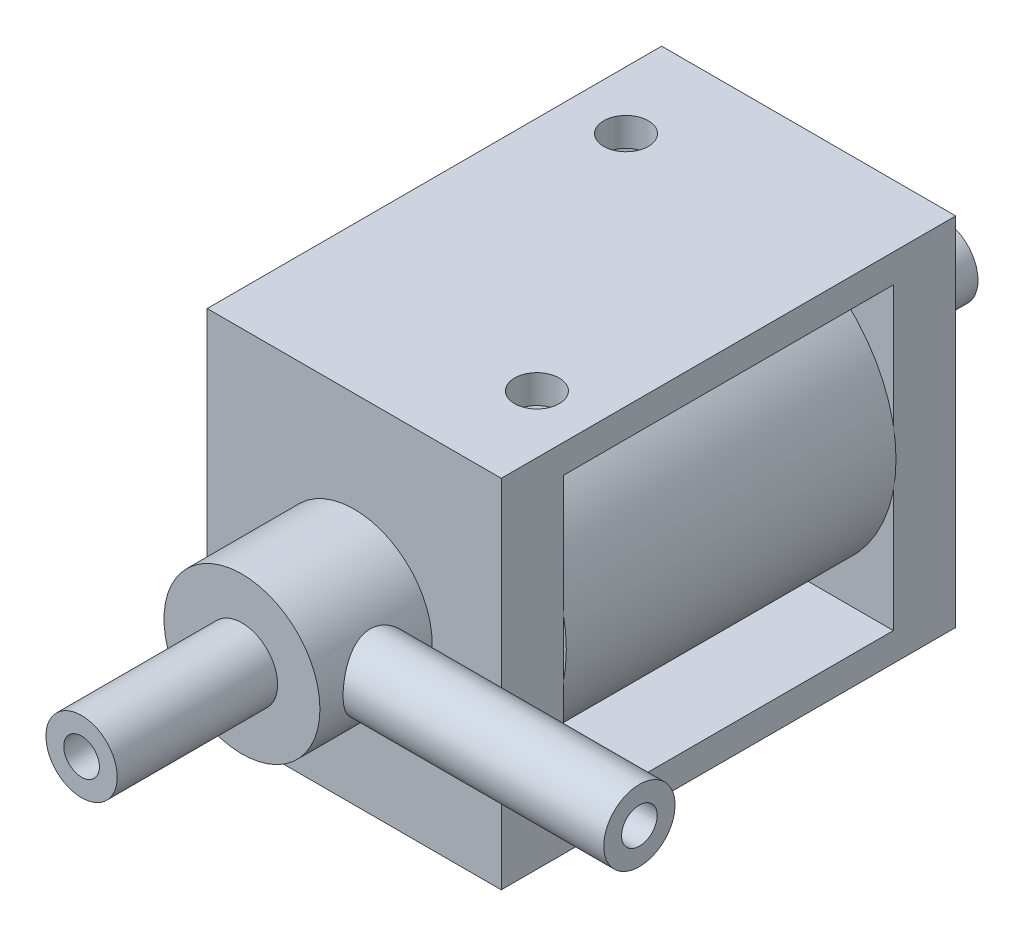
ISO-10303-21;
HEADER;
FILE_DESCRIPTION(('STEP AP214'),'2;1');
FILE_NAME('part.step','',(''),(''),'','','');
FILE_SCHEMA(('AUTOMOTIVE_DESIGN { 1 0 10303 214 1 1 1 1 }'));
ENDSEC;
DATA;
#1=APPLICATION_CONTEXT('core data for automotive mechanical design processes');
#2=APPLICATION_PROTOCOL_DEFINITION('international standard','automotive_design',2000,#1);
#3=PRODUCT_CONTEXT('',#1,'mechanical');
#4=PRODUCT('Part','Part','',(#3));
#5=PRODUCT_RELATED_PRODUCT_CATEGORY('part','',(#4));
#6=PRODUCT_DEFINITION_FORMATION('','',#4);
#7=PRODUCT_DEFINITION_CONTEXT('part definition',#1,'design');
#8=PRODUCT_DEFINITION('design','',#6,#7);
#9=PRODUCT_DEFINITION_SHAPE('','',#8);
#10=(LENGTH_UNIT() NAMED_UNIT(*) SI_UNIT(.MILLI.,.METRE.));
#11=(NAMED_UNIT(*) PLANE_ANGLE_UNIT() SI_UNIT($,.RADIAN.));
#12=(NAMED_UNIT(*) SI_UNIT($,.STERADIAN.) SOLID_ANGLE_UNIT());
#13=UNCERTAINTY_MEASURE_WITH_UNIT(LENGTH_MEASURE(1.E-05),#10,'distance_accuracy_value','');
#14=(GEOMETRIC_REPRESENTATION_CONTEXT(3) GLOBAL_UNCERTAINTY_ASSIGNED_CONTEXT((#13)) GLOBAL_UNIT_ASSIGNED_CONTEXT((#10,
#11,#12)) REPRESENTATION_CONTEXT('',''));
#15=CARTESIAN_POINT('',(0.,0.,0.));
#16=DIRECTION('',(0.,0.,1.));
#17=DIRECTION('',(1.,0.,0.));
#18=AXIS2_PLACEMENT_3D('',#15,#16,#17);
#19=CARTESIAN_POINT('',(0.,0.,19.05));
#20=DIRECTION('',(0.,0.,-1.));
#21=DIRECTION('',(-1.,0.,0.));
#22=AXIS2_PLACEMENT_3D('',#19,#20,#21);
#23=CYLINDRICAL_SURFACE('',#22,4.375);
#24=CARTESIAN_POINT('',(4.375,0.,17.75));
#25=CARTESIAN_POINT('',(4.37499546071433,0.106193365117277,17.7499945368366));
#26=CARTESIAN_POINT('',(4.37109073332979,0.212544209042542,17.7414923973472));
#27=CARTESIAN_POINT('',(4.35585834899322,0.422168273851068,17.7078290942485));
#28=CARTESIAN_POINT('',(4.34451363476174,0.525433851101796,17.6826296481948));
#29=CARTESIAN_POINT('',(4.31560196554178,0.725524948602718,17.6167258561263));
#30=CARTESIAN_POINT('',(4.29805771206282,0.822372454205626,17.5760780385728));
#31=CARTESIAN_POINT('',(4.25840859389427,1.0077598771999,17.4806923568213));
#32=CARTESIAN_POINT('',(4.23630461170441,1.09630139733282,17.4259572186068));
#33=CARTESIAN_POINT('',(4.18826015930736,1.26785379077356,17.300619973238));
#34=CARTESIAN_POINT('',(4.16217839118232,1.35032228554845,17.2293303027463));
#35=CARTESIAN_POINT('',(4.10965587357946,1.5026161842428,17.0743711969988));
#36=CARTESIAN_POINT('',(4.08321490881867,1.57243361073921,16.990694010509));
#37=CARTESIAN_POINT('',(4.03110878098186,1.70174861674835,16.8070821904239));
#38=CARTESIAN_POINT('',(4.00559311754638,1.7603391070202,16.7064615975258));
#39=CARTESIAN_POINT('',(3.96052822141565,1.85952425844656,16.4954753108809));
#40=CARTESIAN_POINT('',(3.9409753207401,1.90012998986918,16.3851156621899));
#41=CARTESIAN_POINT('',(3.9116105066732,1.9598438084694,16.164000222026));
#42=CARTESIAN_POINT('',(3.90132579062807,1.98000289877455,16.053593809305));
#43=CARTESIAN_POINT('',(3.89033941737707,2.00151104221693,15.8305243594248));
#44=CARTESIAN_POINT('',(3.88963077008148,2.0028738158158,15.7178630284212));
#45=CARTESIAN_POINT('',(3.89748507604566,1.98753119797193,15.5050460976564));
#46=CARTESIAN_POINT('',(3.90516587680214,1.97254508123753,15.4047268484583));
#47=CARTESIAN_POINT('',(3.92741699456664,1.92785817840036,15.2082250050207));
#48=CARTESIAN_POINT('',(3.9419889818666,1.89815382479482,15.1120434198414));
#49=CARTESIAN_POINT('',(3.97671876938109,1.82428729059385,14.9239081976233));
#50=CARTESIAN_POINT('',(3.99699653255466,1.77981042971784,14.8321012747295));
#51=CARTESIAN_POINT('',(4.04083939769011,1.67789018695845,14.6568526159929));
#52=CARTESIAN_POINT('',(4.06440591424348,1.62044121877552,14.573414506513));
#53=CARTESIAN_POINT('',(4.11513505494747,1.48723588313,14.4081630059979));
#54=CARTESIAN_POINT('',(4.14241717027686,1.41019883583585,14.3274153389441));
#55=CARTESIAN_POINT('',(4.19548052183614,1.24347071342626,14.1795865111469));
#56=CARTESIAN_POINT('',(4.22126124916282,1.15377538258158,14.1125099652638));
#57=CARTESIAN_POINT('',(4.26946716124552,0.96047163604375,13.991908718962));
#58=CARTESIAN_POINT('',(4.29175400576567,0.856502507415118,13.9389026121808));
#59=CARTESIAN_POINT('',(4.32935104676508,0.63984227925141,13.8515216291546));
#60=CARTESIAN_POINT('',(4.34466589644316,0.527157055885009,13.8171343235719));
#61=CARTESIAN_POINT('',(4.36566890573708,0.305091670846782,13.770393904051));
#62=CARTESIAN_POINT('',(4.3719779901027,0.196070364375256,13.7566160293197));
#63=CARTESIAN_POINT('',(4.37630831194233,-0.0229034238321223,13.7471340762241));
#64=CARTESIAN_POINT('',(4.37433258761118,-0.132855549459489,13.7514233722918));
#65=CARTESIAN_POINT('',(4.36270302709761,-0.343328986731854,13.7770160961574));
#66=CARTESIAN_POINT('',(4.35353478861645,-0.444011306374139,13.7972438190641));
#67=CARTESIAN_POINT('',(4.32900818026246,-0.640399868337555,13.8525545751439));
#68=CARTESIAN_POINT('',(4.31364907370804,-0.736105516929612,13.8876393762582));
#69=CARTESIAN_POINT('',(4.27757960203174,-0.923201182245459,13.9727574348239));
#70=CARTESIAN_POINT('',(4.25671829316956,-1.01436587246377,14.023219840262));
#71=CARTESIAN_POINT('',(4.21177295563386,-1.18725988600378,14.137192755755));
#72=CARTESIAN_POINT('',(4.18768751391252,-1.26898504281731,14.200708993513));
#73=CARTESIAN_POINT('',(4.13630574739342,-1.42799147379549,14.3452440066322));
#74=CARTESIAN_POINT('',(4.10891028541243,-1.50430934352453,14.4272898351303));
#75=CARTESIAN_POINT('',(4.05567490122554,-1.64244275291062,14.6033071503929));
#76=CARTESIAN_POINT('',(4.02983563976401,-1.70425216427245,14.6972836508773));
#77=CARTESIAN_POINT('',(3.98205022058308,-1.81316001205381,14.8980323159779));
#78=CARTESIAN_POINT('',(3.9602356034775,-1.85979034304662,15.0050922682644));
#79=CARTESIAN_POINT('',(3.9245864507608,-1.93389930012533,15.2268702887841));
#80=CARTESIAN_POINT('',(3.91074352559509,-1.96139806698882,15.3415801636632));
#81=CARTESIAN_POINT('',(3.89406781288313,-1.99428429141605,15.5645480753998));
#82=CARTESIAN_POINT('',(3.89037375092534,-2.00140375153077,15.6724862302739));
#83=CARTESIAN_POINT('',(3.89205260827246,-1.99813871754398,15.8880120528146));
#84=CARTESIAN_POINT('',(3.89742326771774,-1.98775858613885,15.995599801139));
#85=CARTESIAN_POINT('',(3.91577558276452,-1.95133124360024,16.1998288981122));
#86=CARTESIAN_POINT('',(3.92822125438508,-1.92638429218147,16.296719880965));
#87=CARTESIAN_POINT('',(3.95879823180269,-1.86273481680529,16.4849104798026));
#88=CARTESIAN_POINT('',(3.97693120718982,-1.82402825306945,16.5762084444565));
#89=CARTESIAN_POINT('',(4.01830328755079,-1.73107154425101,16.7571784139131));
#90=CARTESIAN_POINT('',(4.04179888783152,-1.67596997350038,16.8463530285502));
#91=CARTESIAN_POINT('',(4.09067871316561,-1.55285459074365,17.0147255261307));
#92=CARTESIAN_POINT('',(4.11606377907563,-1.48483500877371,17.093918924463));
#93=CARTESIAN_POINT('',(4.16874511760391,-1.33021281309395,17.2478414735564));
#94=CARTESIAN_POINT('',(4.19599469793495,-1.24246033691109,17.3214374583764));
#95=CARTESIAN_POINT('',(4.24702004952989,-1.05492991579268,17.4530087574762));
#96=CARTESIAN_POINT('',(4.27079420144093,-0.955146404338692,17.5109768005723));
#97=CARTESIAN_POINT('',(4.31207357977044,-0.746876336094879,17.6088463199135));
#98=CARTESIAN_POINT('',(4.32962807027831,-0.638466900780915,17.6488904648511));
#99=CARTESIAN_POINT('',(4.35665048921604,-0.415603909691254,17.7097278251989));
#100=CARTESIAN_POINT('',(4.36614274431195,-0.301169650762393,17.7305789688629));
#101=CARTESIAN_POINT('',(4.37236651902097,-0.15493472081247,17.7442327408113));
#102=CARTESIAN_POINT('',(4.37335222620455,-0.123999599279322,17.746393264481));
#103=CARTESIAN_POINT('',(4.37466963526151,-0.0620474681630114,17.7492777040405));
#104=CARTESIAN_POINT('',(4.37500132641159,-0.0310304572455328,17.7500015963752));
#105=CARTESIAN_POINT('',(4.375,0.,17.75));
#106=B_SPLINE_CURVE_WITH_KNOTS('',3,(#24,#25,#26,#27,#28,#29,#30,#31,#32,#33,#34,#35,#36,#37,
#38,#39,#40,#41,#42,#43,#44,#45,#46,#47,#48,#49,#50,#51,#52,#53,#54,#55,#56,#57,#58,#59,#60,#61,
#62,#63,#64,#65,#66,#67,#68,#69,#70,#71,#72,#73,#74,#75,#76,#77,#78,#79,#80,#81,#82,#83,#84,#85,
#86,#87,#88,#89,#90,#91,#92,#93,#94,#95,#96,#97,#98,#99,#100,#101,#102,#103,#104,#105),
.UNSPECIFIED.,.T.,.F.,(4,2,2,2,2,2,2,2,2,2,2,2,2,2,2,2,2,2,2,2,2,2,2,2,2,2,2,2,2,2,2,2,2,2,2,2,
2,2,2,2,4),(0.,0.318452965679814,0.63763859669901,0.95566734130362,1.27363459159177,
1.60846563880891,1.94350709225491,2.29930134753291,2.65487629320834,2.99107259825779,
3.32702348220124,3.63077420605653,3.93459859104707,4.24536137999883,4.55625825172386,
4.89939468749385,5.24264676217309,5.59719438258375,5.95150502519658,6.27996109559762,
6.60829672552927,6.91619432504297,7.22412857361473,7.54159582342689,7.85920266865742,
8.20372303687421,8.54838866783039,8.90285151687821,9.25694063775477,9.57988718121181,
9.90275322511105,10.2039121320568,10.5051595314257,10.8261208609337,11.1472258897629,
11.4987426691373,11.8504227169221,12.1992514297757,12.5470238233084,12.6400765211623,
12.7331307447037),.UNSPECIFIED.);
#107=CARTESIAN_POINT('',(4.375,0.,17.75));
#108=VERTEX_POINT('',#107);
#109=EDGE_CURVE('E47',#108,#108,#106,.T.);
#110=ORIENTED_EDGE('',*,*,#109,.T.);
#111=EDGE_LOOP('',(#110));
#112=FACE_BOUND('',#111,.T.);
#113=CARTESIAN_POINT('',(0.,0.,19.05));
#114=DIRECTION('',(0.,0.,1.));
#115=DIRECTION('',(1.,0.,0.));
#116=AXIS2_PLACEMENT_3D('',#113,#114,#115);
#117=CIRCLE('',#116,4.375);
#118=CARTESIAN_POINT('',(4.375,0.,19.05));
#119=VERTEX_POINT('',#118);
#120=EDGE_CURVE('E59',#119,#119,#117,.T.);
#121=ORIENTED_EDGE('',*,*,#120,.F.);
#122=EDGE_LOOP('',(#121));
#123=FACE_BOUND('',#122,.T.);
#124=CARTESIAN_POINT('',(0.,0.,12.75));
#125=DIRECTION('',(0.,0.,1.));
#126=DIRECTION('',(1.,0.,0.));
#127=AXIS2_PLACEMENT_3D('',#124,#125,#126);
#128=CIRCLE('',#127,4.375);
#129=CARTESIAN_POINT('',(4.375,0.,12.75));
#130=VERTEX_POINT('',#129);
#131=EDGE_CURVE('E181',#130,#130,#128,.T.);
#132=ORIENTED_EDGE('',*,*,#131,.T.);
#133=EDGE_LOOP('',(#132));
#134=FACE_BOUND('',#133,.T.);
#135=ADVANCED_FACE('F43',(#112,#123,#134),#23,.T.);
#136=CARTESIAN_POINT('',(0.,0.,19.05));
#137=DIRECTION('',(0.,0.,1.));
#138=DIRECTION('',(1.,0.,0.));
#139=AXIS2_PLACEMENT_3D('',#136,#137,#138);
#140=PLANE('',#139);
#141=CARTESIAN_POINT('',(0.,0.,19.05));
#142=DIRECTION('',(0.,0.,1.));
#143=DIRECTION('',(1.,0.,0.));
#144=AXIS2_PLACEMENT_3D('',#141,#142,#143);
#145=CIRCLE('',#144,2.);
#146=CARTESIAN_POINT('',(2.,0.,19.05));
#147=VERTEX_POINT('',#146);
#148=EDGE_CURVE('E185',#147,#147,#145,.T.);
#149=ORIENTED_EDGE('',*,*,#148,.F.);
#150=EDGE_LOOP('',(#149));
#151=FACE_BOUND('',#150,.T.);
#152=ORIENTED_EDGE('',*,*,#120,.T.);
#153=EDGE_LOOP('',(#152));
#154=FACE_BOUND('',#153,.T.);
#155=ADVANCED_FACE('F94',(#151,#154),#140,.T.);
#156=CARTESIAN_POINT('',(0.,0.,12.75));
#157=DIRECTION('',(0.,0.,1.));
#158=DIRECTION('',(1.,0.,0.));
#159=AXIS2_PLACEMENT_3D('',#156,#157,#158);
#160=PLANE('',#159);
#161=ORIENTED_EDGE('',*,*,#131,.F.);
#162=EDGE_LOOP('',(#161));
#163=FACE_BOUND('',#162,.T.);
#164=ADVANCED_FACE('F89',(#163),#160,.F.);
#165=CARTESIAN_POINT('',(0.,0.,28.05));
#166=DIRECTION('',(0.,0.,1.));
#167=DIRECTION('',(1.,0.,0.));
#168=AXIS2_PLACEMENT_3D('',#165,#166,#167);
#169=PLANE('',#168);
#170=CARTESIAN_POINT('',(0.,0.,28.05));
#171=DIRECTION('',(0.,0.,1.));
#172=DIRECTION('',(1.,0.,0.));
#173=AXIS2_PLACEMENT_3D('',#170,#171,#172);
#174=CIRCLE('',#173,2.);
#175=CARTESIAN_POINT('',(2.,0.,28.05));
#176=VERTEX_POINT('',#175);
#177=EDGE_CURVE('E182',#176,#176,#174,.T.);
#178=ORIENTED_EDGE('',*,*,#177,.T.);
#179=EDGE_LOOP('',(#178));
#180=FACE_BOUND('',#179,.T.);
#181=CARTESIAN_POINT('',(0.,0.,28.05));
#182=DIRECTION('',(0.,0.,1.));
#183=DIRECTION('',(1.,0.,0.));
#184=AXIS2_PLACEMENT_3D('',#181,#182,#183);
#185=CIRCLE('',#184,1.);
#186=CARTESIAN_POINT('',(1.,0.,28.05));
#187=VERTEX_POINT('',#186);
#188=EDGE_CURVE('E189',#187,#187,#185,.T.);
#189=ORIENTED_EDGE('',*,*,#188,.F.);
#190=EDGE_LOOP('',(#189));
#191=FACE_BOUND('',#190,.T.);
#192=ADVANCED_FACE('F86',(#180,#191),#169,.T.);
#193=CARTESIAN_POINT('',(0.,0.,28.05));
#194=DIRECTION('',(0.,0.,-1.));
#195=DIRECTION('',(-1.,0.,0.));
#196=AXIS2_PLACEMENT_3D('',#193,#194,#195);
#197=CYLINDRICAL_SURFACE('',#196,2.);
#198=ORIENTED_EDGE('',*,*,#177,.F.);
#199=EDGE_LOOP('',(#198));
#200=FACE_BOUND('',#199,.T.);
#201=ORIENTED_EDGE('',*,*,#148,.T.);
#202=EDGE_LOOP('',(#201));
#203=FACE_BOUND('',#202,.T.);
#204=ADVANCED_FACE('F84',(#200,#203),#197,.T.);
#205=CARTESIAN_POINT('',(0.,0.,28.05));
#206=DIRECTION('',(0.,0.,-1.));
#207=DIRECTION('',(-1.,0.,0.));
#208=AXIS2_PLACEMENT_3D('',#205,#206,#207);
#209=CYLINDRICAL_SURFACE('',#208,1.);
#210=ORIENTED_EDGE('',*,*,#188,.T.);
#211=EDGE_LOOP('',(#210));
#212=FACE_BOUND('',#211,.T.);
#213=CARTESIAN_POINT('',(0.,0.,19.05));
#214=DIRECTION('',(0.,0.,1.));
#215=DIRECTION('',(1.,0.,0.));
#216=AXIS2_PLACEMENT_3D('',#213,#214,#215);
#217=CIRCLE('',#216,1.);
#218=CARTESIAN_POINT('',(1.,0.,19.05));
#219=VERTEX_POINT('',#218);
#220=EDGE_CURVE('E55',#219,#219,#217,.F.);
#221=ORIENTED_EDGE('',*,*,#220,.T.);
#222=EDGE_LOOP('',(#221));
#223=FACE_BOUND('',#222,.T.);
#224=ADVANCED_FACE('F81',(#212,#223),#209,.F.);
#225=ORIENTED_EDGE('',*,*,#220,.F.);
#226=EDGE_LOOP('',(#225));
#227=FACE_BOUND('',#226,.T.);
#228=ADVANCED_FACE('F79',(#227),#140,.T.);
#229=CARTESIAN_POINT('',(19.,0.,15.75));
#230=DIRECTION('',(-1.,0.,0.));
#231=DIRECTION('',(0.,0.,1.));
#232=AXIS2_PLACEMENT_3D('',#229,#230,#231);
#233=CYLINDRICAL_SURFACE('',#232,2.);
#234=CARTESIAN_POINT('',(19.,0.,15.75));
#235=DIRECTION('',(-1.,0.,0.));
#236=DIRECTION('',(0.,0.,1.));
#237=AXIS2_PLACEMENT_3D('',#234,#235,#236);
#238=CIRCLE('',#237,2.);
#239=CARTESIAN_POINT('',(19.,0.,17.75));
#240=VERTEX_POINT('',#239);
#241=EDGE_CURVE('E193',#240,#240,#238,.T.);
#242=ORIENTED_EDGE('',*,*,#241,.T.);
#243=EDGE_LOOP('',(#242));
#244=FACE_BOUND('',#243,.T.);
#245=ORIENTED_EDGE('',*,*,#109,.F.);
#246=EDGE_LOOP('',(#245));
#247=FACE_BOUND('',#246,.T.);
#248=ADVANCED_FACE('F71',(#244,#247),#233,.T.);
#249=CARTESIAN_POINT('',(19.,0.,15.75));
#250=DIRECTION('',(-1.,0.,0.));
#251=DIRECTION('',(0.,0.,1.));
#252=AXIS2_PLACEMENT_3D('',#249,#250,#251);
#253=CYLINDRICAL_SURFACE('',#252,1.);
#254=CARTESIAN_POINT('',(19.,0.,15.75));
#255=DIRECTION('',(-1.,0.,0.));
#256=DIRECTION('',(0.,0.,1.));
#257=AXIS2_PLACEMENT_3D('',#254,#255,#256);
#258=CIRCLE('',#257,1.);
#259=CARTESIAN_POINT('',(19.,0.,16.75));
#260=VERTEX_POINT('',#259);
#261=EDGE_CURVE('E196',#260,#260,#258,.T.);
#262=ORIENTED_EDGE('',*,*,#261,.F.);
#263=EDGE_LOOP('',(#262));
#264=FACE_BOUND('',#263,.T.);
#265=CARTESIAN_POINT('',(4.375,0.,16.75));
#266=CARTESIAN_POINT('',(4.374998992017,0.0553987338206958,16.7499982003981));
#267=CARTESIAN_POINT('',(4.37393713396282,0.110818689239782,16.745380941321));
#268=CARTESIAN_POINT('',(4.36980382628176,0.220080130322669,16.7270556168063));
#269=CARTESIAN_POINT('',(4.36673103037034,0.273920533258113,16.7133414610863));
#270=CARTESIAN_POINT('',(4.358917419308,0.378428401651893,16.6772777156263));
#271=CARTESIAN_POINT('',(4.35417842662918,0.429099262885577,16.6549375583234));
#272=CARTESIAN_POINT('',(4.34354183930829,0.525972554086817,16.6022869078205));
#273=CARTESIAN_POINT('',(4.33764425337255,0.572175017628595,16.5719764745131));
#274=CARTESIAN_POINT('',(4.32521988245972,0.659606421902991,16.5036869475399));
#275=CARTESIAN_POINT('',(4.31868470455059,0.700746349266981,16.4655954078376));
#276=CARTESIAN_POINT('',(4.30577980094118,0.776112477878595,16.3830661526582));
#277=CARTESIAN_POINT('',(4.29941009115495,0.810338016257433,16.3386278294238));
#278=CARTESIAN_POINT('',(4.2874740493319,0.871304330124403,16.243998359466));
#279=CARTESIAN_POINT('',(4.281918443642,0.897948896353852,16.193743754185));
#280=CARTESIAN_POINT('',(4.27236072116839,0.942379328349627,16.0893220320988));
#281=CARTESIAN_POINT('',(4.26835840014716,0.960166358858369,16.0351554307838));
#282=CARTESIAN_POINT('',(4.2624461369274,0.98607975653242,15.9254170245384));
#283=CARTESIAN_POINT('',(4.26050193904803,0.994364482720992,15.8698845002351));
#284=CARTESIAN_POINT('',(4.25882327819447,1.00153076908982,15.7581863552683));
#285=CARTESIAN_POINT('',(4.25908851757211,1.00041359586299,15.7020208208998));
#286=CARTESIAN_POINT('',(4.26176781492727,0.988934903526785,15.591839020284));
#287=CARTESIAN_POINT('',(4.26413878408462,0.978758745529995,15.5378022351749));
#288=CARTESIAN_POINT('',(4.27069410503424,0.949745223997651,15.4322237658541));
#289=CARTESIAN_POINT('',(4.27487856691354,0.930907334652477,15.3806822333265));
#290=CARTESIAN_POINT('',(4.28463096644945,0.884938622195016,15.2810435338298));
#291=CARTESIAN_POINT('',(4.29021051430542,0.857737740698141,15.2329798723914));
#292=CARTESIAN_POINT('',(4.30211746584171,0.795864352314275,15.142031186213));
#293=CARTESIAN_POINT('',(4.30844498022862,0.76119073876088,15.0991469299811));
#294=CARTESIAN_POINT('',(4.32131876263626,0.684381262664833,15.0187086280388));
#295=CARTESIAN_POINT('',(4.32786666251681,0.642088128356429,14.9813048597066));
#296=CARTESIAN_POINT('',(4.34030738362277,0.551753865544904,14.9140950986635));
#297=CARTESIAN_POINT('',(4.34620019076337,0.503712613500486,14.8842892692942));
#298=CARTESIAN_POINT('',(4.35668875071035,0.40305310702006,14.8330789839887));
#299=CARTESIAN_POINT('',(4.36128123689088,0.350423752320151,14.8116956350082));
#300=CARTESIAN_POINT('',(4.36862762683174,0.242190146305765,14.7781188327627));
#301=CARTESIAN_POINT('',(4.37138182315876,0.186586369897361,14.7659239171045));
#302=CARTESIAN_POINT('',(4.37469916678348,0.0752700598482324,14.7512920052733));
#303=CARTESIAN_POINT('',(4.37530835584735,0.0195858179888566,14.7486499272314));
#304=CARTESIAN_POINT('',(4.37439670362892,-0.0914285090066711,14.7526408323307));
#305=CARTESIAN_POINT('',(4.37287602087431,-0.146758620193076,14.7592731251744));
#306=CARTESIAN_POINT('',(4.36790468651016,-0.254804570675561,14.781454705042));
#307=CARTESIAN_POINT('',(4.36447761077611,-0.307543942174929,14.7968951225907));
#308=CARTESIAN_POINT('',(4.35607769764677,-0.409683437160066,14.8361327601916));
#309=CARTESIAN_POINT('',(4.35110472053148,-0.459083258322653,14.8599307356329));
#310=CARTESIAN_POINT('',(4.34005192503343,-0.553979804531902,14.915626183769));
#311=CARTESIAN_POINT('',(4.33395627892191,-0.5994049236002,14.9476424494722));
#312=CARTESIAN_POINT('',(4.32136421413796,-0.684311230387602,15.0187106432417));
#313=CARTESIAN_POINT('',(4.31486773836692,-0.723791568497651,15.0577635752173));
#314=CARTESIAN_POINT('',(4.30204510657645,-0.796508958848094,15.1427413158394));
#315=CARTESIAN_POINT('',(4.29572506376476,-0.829603390227962,15.1887892691614));
#316=CARTESIAN_POINT('',(4.2841201121098,-0.887591054211002,15.2859091946861));
#317=CARTESIAN_POINT('',(4.27883515740294,-0.912484650217416,15.3369809441391));
#318=CARTESIAN_POINT('',(4.26995200589377,-0.953188959219974,15.4424206238056));
#319=CARTESIAN_POINT('',(4.26634407645231,-0.969052203882402,15.4967674133527));
#320=CARTESIAN_POINT('',(4.26120800193017,-0.991395592304954,15.6074492635213));
#321=CARTESIAN_POINT('',(4.25967948860512,-0.99787739743979,15.6637839702886));
#322=CARTESIAN_POINT('',(4.25890001387684,-1.0011982122929,15.7754007557275));
#323=CARTESIAN_POINT('',(4.25959552287008,-0.998263852016477,15.8306758361562));
#324=CARTESIAN_POINT('',(4.26306384958155,-0.983345905321714,15.9399212252236));
#325=CARTESIAN_POINT('',(4.26583663799475,-0.971362446562699,15.9938915522579));
#326=CARTESIAN_POINT('',(4.27311984315789,-0.938800436669163,16.0987953849629));
#327=CARTESIAN_POINT('',(4.27762300323471,-0.918257750497151,16.1497405606461));
#328=CARTESIAN_POINT('',(4.28786179144995,-0.869190216461772,16.2474939491769));
#329=CARTESIAN_POINT('',(4.29359756134085,-0.840664450414953,16.2943016853366));
#330=CARTESIAN_POINT('',(4.30581301138899,-0.775701283561883,16.3835621665546));
#331=CARTESIAN_POINT('',(4.31230628199453,-0.739103626015833,16.4258964398818));
#332=CARTESIAN_POINT('',(4.32521702329615,-0.659356651962533,16.5038968497564));
#333=CARTESIAN_POINT('',(4.33163447601308,-0.616205813785251,16.5395614332769));
#334=CARTESIAN_POINT('',(4.34378078458555,-0.523825077282548,16.6037067196052));
#335=CARTESIAN_POINT('',(4.34949834552898,-0.47451632052015,16.6320761242433));
#336=CARTESIAN_POINT('',(4.3594858021036,-0.371707723854804,16.6800786356034));
#337=CARTESIAN_POINT('',(4.36375685899886,-0.318211288535488,16.6997187542362));
#338=CARTESIAN_POINT('',(4.36964675613247,-0.220585805784552,16.7263784722151));
#339=CARTESIAN_POINT('',(4.37164139044613,-0.176967502104129,16.7352189917084));
#340=CARTESIAN_POINT('',(4.37431838241016,-0.0889039924918735,16.7470303236871));
#341=CARTESIAN_POINT('',(4.37500080893085,-0.0444588300807796,16.7500014442242));
#342=CARTESIAN_POINT('',(4.375,0.,16.75));
#343=B_SPLINE_CURVE_WITH_KNOTS('',3,(#265,#266,#267,#268,#269,#270,#271,#272,#273,#274,#275,
#276,#277,#278,#279,#280,#281,#282,#283,#284,#285,#286,#287,#288,#289,#290,#291,#292,#293,#294,
#295,#296,#297,#298,#299,#300,#301,#302,#303,#304,#305,#306,#307,#308,#309,#310,#311,#312,#313,
#314,#315,#316,#317,#318,#319,#320,#321,#322,#323,#324,#325,#326,#327,#328,#329,#330,#331,#332,
#333,#334,#335,#336,#337,#338,#339,#340,#341,#342),.UNSPECIFIED.,.T.,.F.,(4,2,2,2,2,2,2,2,2,2,2,
2,2,2,2,2,2,2,2,2,2,2,2,2,2,2,2,2,2,2,2,2,2,2,2,2,2,2,4),(0.,0.166033409237604,
0.332178088546157,0.498141602659816,0.664103869675677,0.832659870614451,1.00123202302326,
1.1718567237272,1.34245898180766,1.51017478557121,1.67786799557611,1.84220684807643,
2.00655567806931,2.17232063878065,2.33811016516934,2.50782583465722,2.67754515241092,
2.8476871255931,3.01780201395556,3.18424241211063,3.35067042266053,3.51508460273423,
3.67951364703629,3.84646830756524,4.01344680611867,4.18380672392968,4.35415909157368,
4.5235100780843,4.69283107027628,4.8581076552704,5.02338190868392,5.18797048410835,
5.35257799766961,5.52080705571168,5.68907523698961,5.85977579966859,6.0303389960259,
6.16359183542662,6.29683768095296),.UNSPECIFIED.);
#344=CARTESIAN_POINT('',(4.375,0.,16.75));
#345=VERTEX_POINT('',#344);
#346=EDGE_CURVE('E11',#345,#345,#343,.T.);
#347=ORIENTED_EDGE('',*,*,#346,.T.);
#348=EDGE_LOOP('',(#347));
#349=FACE_BOUND('',#348,.T.);
#350=ADVANCED_FACE('F66',(#264,#349),#253,.F.);
#351=CARTESIAN_POINT('',(19.,0.,15.75));
#352=DIRECTION('',(-1.,0.,0.));
#353=DIRECTION('',(0.,0.,1.));
#354=AXIS2_PLACEMENT_3D('',#351,#352,#353);
#355=PLANE('',#354);
#356=ORIENTED_EDGE('',*,*,#261,.T.);
#357=EDGE_LOOP('',(#356));
#358=FACE_BOUND('',#357,.T.);
#359=ORIENTED_EDGE('',*,*,#241,.F.);
#360=EDGE_LOOP('',(#359));
#361=FACE_BOUND('',#360,.T.);
#362=ADVANCED_FACE('F70',(#358,#361),#355,.F.);
#363=ORIENTED_EDGE('',*,*,#346,.F.);
#364=EDGE_LOOP('',(#363));
#365=FACE_BOUND('',#364,.T.);
#366=ADVANCED_FACE('F74',(#365),#23,.T.);
#367=CLOSED_SHELL('',(#135,#155,#164,#192,#204,#224,#228,#248,#350,#362,#366));
#368=MANIFOLD_SOLID_BREP('B2',#367);
#369=CARTESIAN_POINT('',(0.,0.,33.008787847868));
#370=DIRECTION('',(0.,0.,-1.));
#371=DIRECTION('',(-1.,0.,0.));
#372=AXIS2_PLACEMENT_3D('',#369,#370,#371);
#373=CYLINDRICAL_SURFACE('',#372,8.4);
#374=CARTESIAN_POINT('',(0.,0.,9.25));
#375=DIRECTION('',(0.,0.,1.));
#376=DIRECTION('',(1.,0.,0.));
#377=AXIS2_PLACEMENT_3D('',#374,#375,#376);
#378=CIRCLE('',#377,8.4);
#379=CARTESIAN_POINT('',(8.4,0.,9.25));
#380=VERTEX_POINT('',#379);
#381=EDGE_CURVE('E42',#380,#380,#378,.T.);
#382=ORIENTED_EDGE('',*,*,#381,.F.);
#383=EDGE_LOOP('',(#382));
#384=FACE_BOUND('',#383,.T.);
#385=CARTESIAN_POINT('',(0.,0.,-9.25));
#386=DIRECTION('',(0.,0.,-1.));
#387=DIRECTION('',(0.,1.,0.));
#388=AXIS2_PLACEMENT_3D('',#385,#386,#387);
#389=CIRCLE('',#388,8.4);
#390=CARTESIAN_POINT('',(0.,8.4,-9.25));
#391=VERTEX_POINT('',#390);
#392=EDGE_CURVE('E228',#391,#391,#389,.F.);
#393=ORIENTED_EDGE('',*,*,#392,.T.);
#394=EDGE_LOOP('',(#393));
#395=FACE_BOUND('',#394,.T.);
#396=ADVANCED_FACE('F220',(#384,#395),#373,.T.);
#397=CARTESIAN_POINT('',(-8.25,-8.4,9.25));
#398=DIRECTION('',(0.,0.,1.));
#399=DIRECTION('',(1.,0.,0.));
#400=AXIS2_PLACEMENT_3D('',#397,#398,#399);
#401=PLANE('',#400);
#402=CARTESIAN_POINT('',(0.,0.,9.25));
#403=DIRECTION('',(0.,0.,1.));
#404=DIRECTION('',(1.,0.,0.));
#405=AXIS2_PLACEMENT_3D('',#402,#403,#404);
#406=CIRCLE('',#405,1.);
#407=CARTESIAN_POINT('',(1.,0.,9.25));
#408=VERTEX_POINT('',#407);
#409=EDGE_CURVE('E232',#408,#408,#406,.F.);
#410=ORIENTED_EDGE('',*,*,#409,.T.);
#411=EDGE_LOOP('',(#410));
#412=FACE_BOUND('',#411,.T.);
#413=ORIENTED_EDGE('',*,*,#381,.T.);
#414=EDGE_LOOP('',(#413));
#415=FACE_BOUND('',#414,.T.);
#416=ADVANCED_FACE('F222',(#412,#415),#401,.T.);
#417=CARTESIAN_POINT('',(-8.25,-8.4,-9.25));
#418=DIRECTION('',(0.,0.,-1.));
#419=DIRECTION('',(0.,1.,0.));
#420=AXIS2_PLACEMENT_3D('',#417,#418,#419);
#421=PLANE('',#420);
#422=CARTESIAN_POINT('',(0.,0.,-9.25));
#423=DIRECTION('',(0.,0.,-1.));
#424=DIRECTION('',(0.,1.,0.));
#425=AXIS2_PLACEMENT_3D('',#422,#423,#424);
#426=CIRCLE('',#425,1.);
#427=CARTESIAN_POINT('',(0.,1.,-9.25));
#428=VERTEX_POINT('',#427);
#429=EDGE_CURVE('E224',#428,#428,#426,.F.);
#430=ORIENTED_EDGE('',*,*,#429,.T.);
#431=EDGE_LOOP('',(#430));
#432=FACE_BOUND('',#431,.T.);
#433=ORIENTED_EDGE('',*,*,#392,.F.);
#434=EDGE_LOOP('',(#433));
#435=FACE_BOUND('',#434,.T.);
#436=ADVANCED_FACE('F241',(#432,#435),#421,.T.);
#437=CARTESIAN_POINT('',(0.,0.,12.75));
#438=DIRECTION('',(0.,0.,-1.));
#439=DIRECTION('',(-1.,0.,0.));
#440=AXIS2_PLACEMENT_3D('',#437,#438,#439);
#441=CYLINDRICAL_SURFACE('',#440,1.);
#442=ORIENTED_EDGE('',*,*,#409,.F.);
#443=EDGE_LOOP('',(#442));
#444=FACE_BOUND('',#443,.T.);
#445=ORIENTED_EDGE('',*,*,#429,.F.);
#446=EDGE_LOOP('',(#445));
#447=FACE_BOUND('',#446,.T.);
#448=ADVANCED_FACE('F244',(#444,#447),#441,.F.);
#449=CLOSED_SHELL('',(#396,#416,#436,#448));
#450=MANIFOLD_SOLID_BREP('B6',#449);
#451=CARTESIAN_POINT('',(-8.25,-10.,-12.75));
#452=DIRECTION('',(0.,0.,-1.));
#453=DIRECTION('',(-1.,0.,0.));
#454=AXIS2_PLACEMENT_3D('',#451,#452,#453);
#455=PLANE('',#454);
#456=CARTESIAN_POINT('',(0.,0.,-12.75));
#457=DIRECTION('',(0.,0.,1.));
#458=DIRECTION('',(1.,0.,0.));
#459=AXIS2_PLACEMENT_3D('',#456,#457,#458);
#460=CIRCLE('',#459,2.);
#461=CARTESIAN_POINT('',(2.,0.,-12.75));
#462=VERTEX_POINT('',#461);
#463=EDGE_CURVE('E445',#462,#462,#460,.T.);
#464=ORIENTED_EDGE('',*,*,#463,.T.);
#465=EDGE_LOOP('',(#464));
#466=FACE_BOUND('',#465,.T.);
#467=DIRECTION('',(1.,0.,0.));
#468=VECTOR('',#467,1.);
#469=CARTESIAN_POINT('',(-8.25,10.,-12.75));
#470=LINE('',#469,#468);
#471=CARTESIAN_POINT('',(-8.25,10.,-12.75));
#472=VERTEX_POINT('',#471);
#473=CARTESIAN_POINT('',(8.25,10.,-12.75));
#474=VERTEX_POINT('',#473);
#475=EDGE_CURVE('E410',#472,#474,#470,.T.);
#476=ORIENTED_EDGE('',*,*,#475,.T.);
#477=DIRECTION('',(0.,1.,0.));
#478=VECTOR('',#477,1.);
#479=CARTESIAN_POINT('',(8.25,-10.,-12.75));
#480=LINE('',#479,#478);
#481=CARTESIAN_POINT('',(8.25,-10.,-12.75));
#482=VERTEX_POINT('',#481);
#483=EDGE_CURVE('E378',#482,#474,#480,.T.);
#484=ORIENTED_EDGE('',*,*,#483,.F.);
#485=DIRECTION('',(1.,0.,0.));
#486=VECTOR('',#485,1.);
#487=CARTESIAN_POINT('',(-8.25,-10.,-12.75));
#488=LINE('',#487,#486);
#489=CARTESIAN_POINT('',(-8.25,-10.,-12.75));
#490=VERTEX_POINT('',#489);
#491=EDGE_CURVE('E218',#490,#482,#488,.T.);
#492=ORIENTED_EDGE('',*,*,#491,.F.);
#493=DIRECTION('',(0.,1.,0.));
#494=VECTOR('',#493,1.);
#495=CARTESIAN_POINT('',(-8.25,-10.,-12.75));
#496=LINE('',#495,#494);
#497=EDGE_CURVE('E397',#490,#472,#496,.T.);
#498=ORIENTED_EDGE('',*,*,#497,.T.);
#499=EDGE_LOOP('',(#476,#484,#492,#498));
#500=FACE_BOUND('',#499,.T.);
#501=ADVANCED_FACE('F281',(#466,#500),#455,.T.);
#502=CARTESIAN_POINT('',(-8.25,-10.,12.75));
#503=DIRECTION('',(0.,-1.,0.));
#504=DIRECTION('',(0.,0.,-1.));
#505=AXIS2_PLACEMENT_3D('',#502,#503,#504);
#506=PLANE('',#505);
#507=ORIENTED_EDGE('',*,*,#491,.T.);
#508=DIRECTION('',(0.,0.,-1.));
#509=VECTOR('',#508,1.);
#510=CARTESIAN_POINT('',(8.25,-10.,12.75));
#511=LINE('',#510,#509);
#512=CARTESIAN_POINT('',(8.25,-10.,12.75));
#513=VERTEX_POINT('',#512);
#514=EDGE_CURVE('E387',#513,#482,#511,.T.);
#515=ORIENTED_EDGE('',*,*,#514,.F.);
#516=DIRECTION('',(1.,0.,0.));
#517=VECTOR('',#516,1.);
#518=CARTESIAN_POINT('',(-8.25,-10.,12.75));
#519=LINE('',#518,#517);
#520=CARTESIAN_POINT('',(-8.25,-10.,12.75));
#521=VERTEX_POINT('',#520);
#522=EDGE_CURVE('E289',#521,#513,#519,.T.);
#523=ORIENTED_EDGE('',*,*,#522,.F.);
#524=DIRECTION('',(0.,0.,-1.));
#525=VECTOR('',#524,1.);
#526=CARTESIAN_POINT('',(-8.25,-10.,12.75));
#527=LINE('',#526,#525);
#528=EDGE_CURVE('E408',#521,#490,#527,.T.);
#529=ORIENTED_EDGE('',*,*,#528,.T.);
#530=EDGE_LOOP('',(#507,#515,#523,#529));
#531=FACE_BOUND('',#530,.T.);
#532=ADVANCED_FACE('F422',(#531),#506,.T.);
#533=CARTESIAN_POINT('',(-8.25,-10.,12.75));
#534=DIRECTION('',(0.,0.,1.));
#535=DIRECTION('',(1.,0.,0.));
#536=AXIS2_PLACEMENT_3D('',#533,#534,#535);
#537=PLANE('',#536);
#538=CARTESIAN_POINT('',(0.,0.,12.75));
#539=DIRECTION('',(0.,0.,-1.));
#540=DIRECTION('',(-1.,0.,0.));
#541=AXIS2_PLACEMENT_3D('',#538,#539,#540);
#542=CIRCLE('',#541,1.);
#543=CARTESIAN_POINT('',(-1.,0.,12.75));
#544=VERTEX_POINT('',#543);
#545=EDGE_CURVE('E456',#544,#544,#542,.F.);
#546=ORIENTED_EDGE('',*,*,#545,.F.);
#547=EDGE_LOOP('',(#546));
#548=FACE_BOUND('',#547,.T.);
#549=ORIENTED_EDGE('',*,*,#522,.T.);
#550=DIRECTION('',(0.,-1.,0.));
#551=VECTOR('',#550,1.);
#552=CARTESIAN_POINT('',(8.25,-10.,12.75));
#553=LINE('',#552,#551);
#554=CARTESIAN_POINT('',(8.25,10.,12.75));
#555=VERTEX_POINT('',#554);
#556=EDGE_CURVE('E384',#555,#513,#553,.T.);
#557=ORIENTED_EDGE('',*,*,#556,.F.);
#558=DIRECTION('',(1.,0.,0.));
#559=VECTOR('',#558,1.);
#560=CARTESIAN_POINT('',(-8.25,10.,12.75));
#561=LINE('',#560,#559);
#562=CARTESIAN_POINT('',(-8.25,10.,12.75));
#563=VERTEX_POINT('',#562);
#564=EDGE_CURVE('E413',#563,#555,#561,.T.);
#565=ORIENTED_EDGE('',*,*,#564,.F.);
#566=DIRECTION('',(0.,-1.,0.));
#567=VECTOR('',#566,1.);
#568=CARTESIAN_POINT('',(-8.25,-10.,12.75));
#569=LINE('',#568,#567);
#570=EDGE_CURVE('E405',#563,#521,#569,.T.);
#571=ORIENTED_EDGE('',*,*,#570,.T.);
#572=EDGE_LOOP('',(#549,#557,#565,#571));
#573=FACE_BOUND('',#572,.T.);
#574=ADVANCED_FACE('F428',(#548,#573),#537,.T.);
#575=CARTESIAN_POINT('',(-8.25,10.,12.75));
#576=DIRECTION('',(0.,1.,0.));
#577=DIRECTION('',(0.,0.,1.));
#578=AXIS2_PLACEMENT_3D('',#575,#576,#577);
#579=PLANE('',#578);
#580=CARTESIAN_POINT('',(5.,10.,7.5));
#581=DIRECTION('',(0.,1.,0.));
#582=DIRECTION('',(0.,0.,1.));
#583=AXIS2_PLACEMENT_3D('',#580,#581,#582);
#584=CIRCLE('',#583,1.24999999999999);
#585=CARTESIAN_POINT('',(5.,10.,8.74999999999999));
#586=VERTEX_POINT('',#585);
#587=EDGE_CURVE('E468',#586,#586,#584,.T.);
#588=ORIENTED_EDGE('',*,*,#587,.F.);
#589=EDGE_LOOP('',(#588));
#590=FACE_BOUND('',#589,.T.);
#591=CARTESIAN_POINT('',(-5.,10.,-7.5));
#592=DIRECTION('',(0.,1.,0.));
#593=DIRECTION('',(0.,0.,1.));
#594=AXIS2_PLACEMENT_3D('',#591,#592,#593);
#595=CIRCLE('',#594,1.24999999999999);
#596=CARTESIAN_POINT('',(-5.,10.,-6.25000000000001));
#597=VERTEX_POINT('',#596);
#598=EDGE_CURVE('E462',#597,#597,#595,.T.);
#599=ORIENTED_EDGE('',*,*,#598,.F.);
#600=EDGE_LOOP('',(#599));
#601=FACE_BOUND('',#600,.T.);
#602=ORIENTED_EDGE('',*,*,#564,.T.);
#603=DIRECTION('',(0.,0.,1.));
#604=VECTOR('',#603,1.);
#605=CARTESIAN_POINT('',(8.25,10.,12.75));
#606=LINE('',#605,#604);
#607=EDGE_CURVE('E381',#474,#555,#606,.T.);
#608=ORIENTED_EDGE('',*,*,#607,.F.);
#609=ORIENTED_EDGE('',*,*,#475,.F.);
#610=DIRECTION('',(0.,0.,1.));
#611=VECTOR('',#610,1.);
#612=CARTESIAN_POINT('',(-8.25,10.,12.75));
#613=LINE('',#612,#611);
#614=EDGE_CURVE('E402',#472,#563,#613,.T.);
#615=ORIENTED_EDGE('',*,*,#614,.T.);
#616=EDGE_LOOP('',(#602,#608,#609,#615));
#617=FACE_BOUND('',#616,.T.);
#618=ADVANCED_FACE('F417',(#590,#601,#617),#579,.T.);
#619=CARTESIAN_POINT('',(-8.25,0.,0.));
#620=DIRECTION('',(-1.,0.,0.));
#621=DIRECTION('',(0.,0.,1.));
#622=AXIS2_PLACEMENT_3D('',#619,#620,#621);
#623=PLANE('',#622);
#624=DIRECTION('',(0.,1.,0.));
#625=VECTOR('',#624,1.);
#626=CARTESIAN_POINT('',(-8.25,-8.4,-9.25));
#627=LINE('',#626,#625);
#628=CARTESIAN_POINT('',(-8.25,-8.4,-9.25));
#629=VERTEX_POINT('',#628);
#630=CARTESIAN_POINT('',(-8.25,8.4,-9.25));
#631=VERTEX_POINT('',#630);
#632=EDGE_CURVE('E390',#629,#631,#627,.T.);
#633=ORIENTED_EDGE('',*,*,#632,.T.);
#634=DIRECTION('',(0.,0.,1.));
#635=VECTOR('',#634,1.);
#636=CARTESIAN_POINT('',(-8.25,8.4,9.25));
#637=LINE('',#636,#635);
#638=CARTESIAN_POINT('',(-8.25,8.4,9.25));
#639=VERTEX_POINT('',#638);
#640=EDGE_CURVE('E353',#631,#639,#637,.T.);
#641=ORIENTED_EDGE('',*,*,#640,.T.);
#642=DIRECTION('',(0.,-1.,0.));
#643=VECTOR('',#642,1.);
#644=CARTESIAN_POINT('',(-8.25,-8.4,9.25));
#645=LINE('',#644,#643);
#646=CARTESIAN_POINT('',(-8.25,-8.4,9.25));
#647=VERTEX_POINT('',#646);
#648=EDGE_CURVE('E297',#639,#647,#645,.T.);
#649=ORIENTED_EDGE('',*,*,#648,.T.);
#650=DIRECTION('',(0.,0.,-1.));
#651=VECTOR('',#650,1.);
#652=CARTESIAN_POINT('',(-8.25,-8.4,9.25));
#653=LINE('',#652,#651);
#654=EDGE_CURVE('E358',#647,#629,#653,.T.);
#655=ORIENTED_EDGE('',*,*,#654,.T.);
#656=EDGE_LOOP('',(#633,#641,#649,#655));
#657=FACE_BOUND('',#656,.T.);
#658=ORIENTED_EDGE('',*,*,#497,.F.);
#659=ORIENTED_EDGE('',*,*,#528,.F.);
#660=ORIENTED_EDGE('',*,*,#570,.F.);
#661=ORIENTED_EDGE('',*,*,#614,.F.);
#662=EDGE_LOOP('',(#658,#659,#660,#661));
#663=FACE_BOUND('',#662,.T.);
#664=ADVANCED_FACE('F426',(#657,#663),#623,.T.);
#665=CARTESIAN_POINT('',(-8.25,-8.4,-9.25));
#666=DIRECTION('',(0.,0.,-1.));
#667=DIRECTION('',(0.,1.,0.));
#668=AXIS2_PLACEMENT_3D('',#665,#666,#667);
#669=PLANE('',#668);
#670=CARTESIAN_POINT('',(0.,0.,-9.25));
#671=DIRECTION('',(0.,0.,-1.));
#672=DIRECTION('',(0.,1.,0.));
#673=AXIS2_PLACEMENT_3D('',#670,#671,#672);
#674=CIRCLE('',#673,1.);
#675=CARTESIAN_POINT('',(0.,1.,-9.25));
#676=VERTEX_POINT('',#675);
#677=EDGE_CURVE('E451',#676,#676,#674,.F.);
#678=ORIENTED_EDGE('',*,*,#677,.F.);
#679=EDGE_LOOP('',(#678));
#680=FACE_BOUND('',#679,.T.);
#681=DIRECTION('',(1.,0.,0.));
#682=VECTOR('',#681,1.);
#683=CARTESIAN_POINT('',(-8.25,-8.4,-9.25));
#684=LINE('',#683,#682);
#685=CARTESIAN_POINT('',(8.25,-8.4,-9.25));
#686=VERTEX_POINT('',#685);
#687=EDGE_CURVE('E363',#629,#686,#684,.T.);
#688=ORIENTED_EDGE('',*,*,#687,.T.);
#689=DIRECTION('',(0.,1.,0.));
#690=VECTOR('',#689,1.);
#691=CARTESIAN_POINT('',(8.25,-8.4,-9.25));
#692=LINE('',#691,#690);
#693=CARTESIAN_POINT('',(8.25,8.4,-9.25));
#694=VERTEX_POINT('',#693);
#695=EDGE_CURVE('E361',#686,#694,#692,.T.);
#696=ORIENTED_EDGE('',*,*,#695,.T.);
#697=DIRECTION('',(1.,0.,0.));
#698=VECTOR('',#697,1.);
#699=CARTESIAN_POINT('',(-8.25,8.4,-9.25));
#700=LINE('',#699,#698);
#701=EDGE_CURVE('E346',#631,#694,#700,.T.);
#702=ORIENTED_EDGE('',*,*,#701,.F.);
#703=ORIENTED_EDGE('',*,*,#632,.F.);
#704=EDGE_LOOP('',(#688,#696,#702,#703));
#705=FACE_BOUND('',#704,.T.);
#706=ADVANCED_FACE('F362',(#680,#705),#669,.F.);
#707=CARTESIAN_POINT('',(-8.25,-8.4,9.25));
#708=DIRECTION('',(0.,-1.,0.));
#709=DIRECTION('',(0.,0.,-1.));
#710=AXIS2_PLACEMENT_3D('',#707,#708,#709);
#711=PLANE('',#710);
#712=DIRECTION('',(1.,0.,0.));
#713=VECTOR('',#712,1.);
#714=CARTESIAN_POINT('',(-8.25,-8.4,9.25));
#715=LINE('',#714,#713);
#716=CARTESIAN_POINT('',(8.25,-8.4,9.25));
#717=VERTEX_POINT('',#716);
#718=EDGE_CURVE('E398',#647,#717,#715,.T.);
#719=ORIENTED_EDGE('',*,*,#718,.T.);
#720=DIRECTION('',(0.,0.,-1.));
#721=VECTOR('',#720,1.);
#722=CARTESIAN_POINT('',(8.25,-8.4,9.25));
#723=LINE('',#722,#721);
#724=EDGE_CURVE('E373',#717,#686,#723,.T.);
#725=ORIENTED_EDGE('',*,*,#724,.T.);
#726=ORIENTED_EDGE('',*,*,#687,.F.);
#727=ORIENTED_EDGE('',*,*,#654,.F.);
#728=EDGE_LOOP('',(#719,#725,#726,#727));
#729=FACE_BOUND('',#728,.T.);
#730=ADVANCED_FACE('F505',(#729),#711,.F.);
#731=CARTESIAN_POINT('',(-8.25,-8.4,9.25));
#732=DIRECTION('',(0.,0.,1.));
#733=DIRECTION('',(1.,0.,0.));
#734=AXIS2_PLACEMENT_3D('',#731,#732,#733);
#735=PLANE('',#734);
#736=CARTESIAN_POINT('',(0.,0.,9.25));
#737=DIRECTION('',(0.,0.,1.));
#738=DIRECTION('',(1.,0.,0.));
#739=AXIS2_PLACEMENT_3D('',#736,#737,#738);
#740=CIRCLE('',#739,1.);
#741=CARTESIAN_POINT('',(1.,0.,9.25));
#742=VERTEX_POINT('',#741);
#743=EDGE_CURVE('E284',#742,#742,#740,.F.);
#744=ORIENTED_EDGE('',*,*,#743,.F.);
#745=EDGE_LOOP('',(#744));
#746=FACE_BOUND('',#745,.T.);
#747=DIRECTION('',(1.,0.,0.));
#748=VECTOR('',#747,1.);
#749=CARTESIAN_POINT('',(-8.25,8.4,9.25));
#750=LINE('',#749,#748);
#751=CARTESIAN_POINT('',(8.25,8.4,9.25));
#752=VERTEX_POINT('',#751);
#753=EDGE_CURVE('E357',#639,#752,#750,.T.);
#754=ORIENTED_EDGE('',*,*,#753,.T.);
#755=DIRECTION('',(0.,-1.,0.));
#756=VECTOR('',#755,1.);
#757=CARTESIAN_POINT('',(8.25,-8.4,9.25));
#758=LINE('',#757,#756);
#759=EDGE_CURVE('E371',#752,#717,#758,.T.);
#760=ORIENTED_EDGE('',*,*,#759,.T.);
#761=ORIENTED_EDGE('',*,*,#718,.F.);
#762=ORIENTED_EDGE('',*,*,#648,.F.);
#763=EDGE_LOOP('',(#754,#760,#761,#762));
#764=FACE_BOUND('',#763,.T.);
#765=ADVANCED_FACE('F508',(#746,#764),#735,.F.);
#766=CARTESIAN_POINT('',(-8.25,8.4,9.25));
#767=DIRECTION('',(0.,1.,0.));
#768=DIRECTION('',(0.,0.,1.));
#769=AXIS2_PLACEMENT_3D('',#766,#767,#768);
#770=PLANE('',#769);
#771=CARTESIAN_POINT('',(5.,8.4,7.5));
#772=DIRECTION('',(0.,1.,0.));
#773=DIRECTION('',(0.,0.,1.));
#774=AXIS2_PLACEMENT_3D('',#771,#772,#773);
#775=CIRCLE('',#774,1.24999999999999);
#776=CARTESIAN_POINT('',(5.,8.4,8.74999999999999));
#777=VERTEX_POINT('',#776);
#778=EDGE_CURVE('E465',#777,#777,#775,.T.);
#779=ORIENTED_EDGE('',*,*,#778,.T.);
#780=EDGE_LOOP('',(#779));
#781=FACE_BOUND('',#780,.T.);
#782=CARTESIAN_POINT('',(-5.,8.4,-7.5));
#783=DIRECTION('',(0.,1.,0.));
#784=DIRECTION('',(0.,0.,1.));
#785=AXIS2_PLACEMENT_3D('',#782,#783,#784);
#786=CIRCLE('',#785,1.24999999999999);
#787=CARTESIAN_POINT('',(-5.,8.4,-6.25));
#788=VERTEX_POINT('',#787);
#789=EDGE_CURVE('E459',#788,#788,#786,.T.);
#790=ORIENTED_EDGE('',*,*,#789,.T.);
#791=EDGE_LOOP('',(#790));
#792=FACE_BOUND('',#791,.T.);
#793=ORIENTED_EDGE('',*,*,#701,.T.);
#794=DIRECTION('',(0.,0.,1.));
#795=VECTOR('',#794,1.);
#796=CARTESIAN_POINT('',(8.25,8.4,9.25));
#797=LINE('',#796,#795);
#798=EDGE_CURVE('E350',#694,#752,#797,.T.);
#799=ORIENTED_EDGE('',*,*,#798,.T.);
#800=ORIENTED_EDGE('',*,*,#753,.F.);
#801=ORIENTED_EDGE('',*,*,#640,.F.);
#802=EDGE_LOOP('',(#793,#799,#800,#801));
#803=FACE_BOUND('',#802,.T.);
#804=ADVANCED_FACE('F348',(#781,#792,#803),#770,.F.);
#805=CARTESIAN_POINT('',(8.25,0.,0.));
#806=DIRECTION('',(-1.,0.,0.));
#807=DIRECTION('',(0.,0.,1.));
#808=AXIS2_PLACEMENT_3D('',#805,#806,#807);
#809=PLANE('',#808);
#810=ORIENTED_EDGE('',*,*,#483,.T.);
#811=ORIENTED_EDGE('',*,*,#607,.T.);
#812=ORIENTED_EDGE('',*,*,#556,.T.);
#813=ORIENTED_EDGE('',*,*,#514,.T.);
#814=EDGE_LOOP('',(#810,#811,#812,#813));
#815=FACE_BOUND('',#814,.T.);
#816=ORIENTED_EDGE('',*,*,#695,.F.);
#817=ORIENTED_EDGE('',*,*,#724,.F.);
#818=ORIENTED_EDGE('',*,*,#759,.F.);
#819=ORIENTED_EDGE('',*,*,#798,.F.);
#820=EDGE_LOOP('',(#816,#817,#818,#819));
#821=FACE_BOUND('',#820,.T.);
#822=ADVANCED_FACE('F369',(#815,#821),#809,.F.);
#823=CARTESIAN_POINT('',(0.,0.,-20.25));
#824=DIRECTION('',(0.,0.,1.));
#825=DIRECTION('',(1.,0.,0.));
#826=AXIS2_PLACEMENT_3D('',#823,#824,#825);
#827=CYLINDRICAL_SURFACE('',#826,2.);
#828=CARTESIAN_POINT('',(0.,0.,-20.25));
#829=DIRECTION('',(0.,0.,1.));
#830=DIRECTION('',(1.,0.,0.));
#831=AXIS2_PLACEMENT_3D('',#828,#829,#830);
#832=CIRCLE('',#831,2.);
#833=CARTESIAN_POINT('',(2.,0.,-20.25));
#834=VERTEX_POINT('',#833);
#835=EDGE_CURVE('E367',#834,#834,#832,.T.);
#836=ORIENTED_EDGE('',*,*,#835,.T.);
#837=EDGE_LOOP('',(#836));
#838=FACE_BOUND('',#837,.T.);
#839=ORIENTED_EDGE('',*,*,#463,.F.);
#840=EDGE_LOOP('',(#839));
#841=FACE_BOUND('',#840,.T.);
#842=ADVANCED_FACE('F498',(#838,#841),#827,.T.);
#843=CARTESIAN_POINT('',(0.,0.,-20.25));
#844=DIRECTION('',(0.,0.,1.));
#845=DIRECTION('',(1.,0.,0.));
#846=AXIS2_PLACEMENT_3D('',#843,#844,#845);
#847=PLANE('',#846);
#848=CARTESIAN_POINT('',(0.,0.,-20.25));
#849=DIRECTION('',(0.,0.,1.));
#850=DIRECTION('',(1.,0.,0.));
#851=AXIS2_PLACEMENT_3D('',#848,#849,#850);
#852=CIRCLE('',#851,1.);
#853=CARTESIAN_POINT('',(1.,0.,-20.25));
#854=VERTEX_POINT('',#853);
#855=EDGE_CURVE('E447',#854,#854,#852,.T.);
#856=ORIENTED_EDGE('',*,*,#855,.T.);
#857=EDGE_LOOP('',(#856));
#858=FACE_BOUND('',#857,.T.);
#859=ORIENTED_EDGE('',*,*,#835,.F.);
#860=EDGE_LOOP('',(#859));
#861=FACE_BOUND('',#860,.T.);
#862=ADVANCED_FACE('F494',(#858,#861),#847,.F.);
#863=CARTESIAN_POINT('',(0.,0.,-20.25));
#864=DIRECTION('',(0.,0.,1.));
#865=DIRECTION('',(1.,0.,0.));
#866=AXIS2_PLACEMENT_3D('',#863,#864,#865);
#867=CYLINDRICAL_SURFACE('',#866,1.);
#868=ORIENTED_EDGE('',*,*,#855,.F.);
#869=EDGE_LOOP('',(#868));
#870=FACE_BOUND('',#869,.T.);
#871=ORIENTED_EDGE('',*,*,#677,.T.);
#872=EDGE_LOOP('',(#871));
#873=FACE_BOUND('',#872,.T.);
#874=ADVANCED_FACE('F487',(#870,#873),#867,.F.);
#875=CARTESIAN_POINT('',(0.,0.,12.75));
#876=DIRECTION('',(0.,0.,-1.));
#877=DIRECTION('',(-1.,0.,0.));
#878=AXIS2_PLACEMENT_3D('',#875,#876,#877);
#879=CYLINDRICAL_SURFACE('',#878,1.);
#880=ORIENTED_EDGE('',*,*,#545,.T.);
#881=EDGE_LOOP('',(#880));
#882=FACE_BOUND('',#881,.T.);
#883=ORIENTED_EDGE('',*,*,#743,.T.);
#884=EDGE_LOOP('',(#883));
#885=FACE_BOUND('',#884,.T.);
#886=ADVANCED_FACE('F478',(#882,#885),#879,.F.);
#887=CARTESIAN_POINT('',(-5.,10.,-7.5));
#888=DIRECTION('',(0.,1.,0.));
#889=DIRECTION('',(0.,0.,1.));
#890=AXIS2_PLACEMENT_3D('',#887,#888,#889);
#891=CYLINDRICAL_SURFACE('',#890,1.24999999999999);
#892=ORIENTED_EDGE('',*,*,#789,.F.);
#893=EDGE_LOOP('',(#892));
#894=FACE_BOUND('',#893,.T.);
#895=ORIENTED_EDGE('',*,*,#598,.T.);
#896=EDGE_LOOP('',(#895));
#897=FACE_BOUND('',#896,.T.);
#898=ADVANCED_FACE('F476',(#894,#897),#891,.F.);
#899=CARTESIAN_POINT('',(5.,10.,7.5));
#900=DIRECTION('',(0.,1.,0.));
#901=DIRECTION('',(0.,0.,1.));
#902=AXIS2_PLACEMENT_3D('',#899,#900,#901);
#903=CYLINDRICAL_SURFACE('',#902,1.24999999999999);
#904=ORIENTED_EDGE('',*,*,#778,.F.);
#905=EDGE_LOOP('',(#904));
#906=FACE_BOUND('',#905,.T.);
#907=ORIENTED_EDGE('',*,*,#587,.T.);
#908=EDGE_LOOP('',(#907));
#909=FACE_BOUND('',#908,.T.);
#910=ADVANCED_FACE('F472',(#906,#909),#903,.F.);
#911=CLOSED_SHELL('',(#501,#532,#574,#618,#664,#706,#730,#765,#804,#822,#842,#862,#874,#886,
#898,#910));
#912=MANIFOLD_SOLID_BREP('B37',#911);
#913=ADVANCED_BREP_SHAPE_REPRESENTATION('',(#18,#368,#450,#912),#14);
#914=SHAPE_DEFINITION_REPRESENTATION(#9,#913);
ENDSEC;
END-ISO-10303-21;
